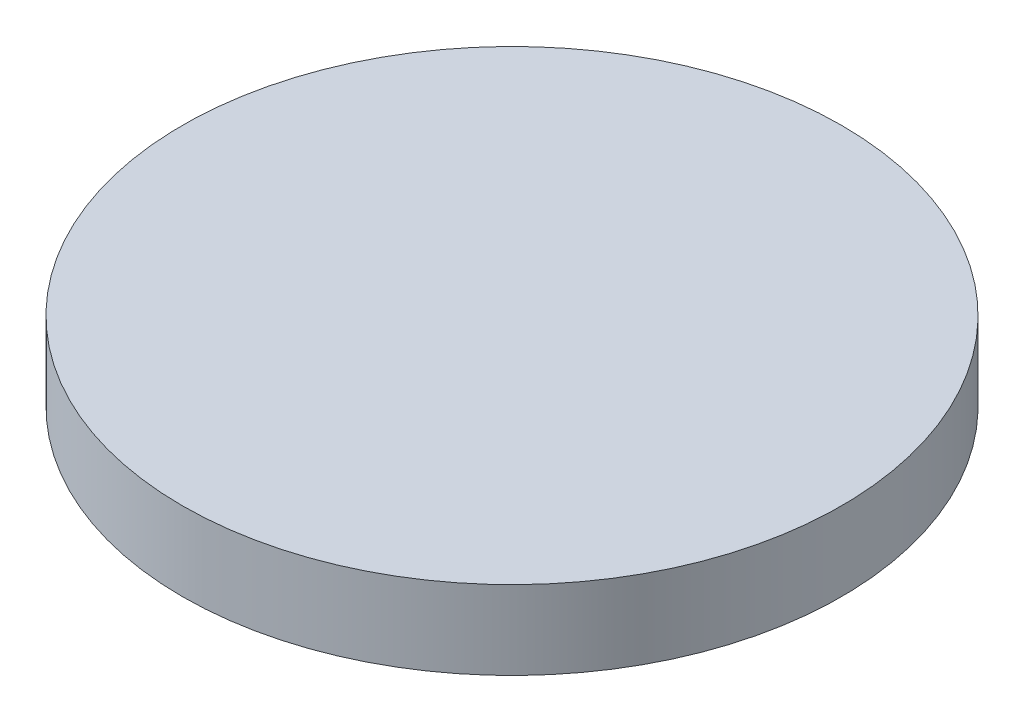
ISO-10303-21;
HEADER;
FILE_DESCRIPTION(('STEP AP214'),'2;1');
FILE_NAME('part.step','',(''),(''),'','','');
FILE_SCHEMA(('AUTOMOTIVE_DESIGN { 1 0 10303 214 1 1 1 1 }'));
ENDSEC;
DATA;
#1=APPLICATION_CONTEXT('core data for automotive mechanical design processes');
#2=APPLICATION_PROTOCOL_DEFINITION('international standard','automotive_design',2000,#1);
#3=PRODUCT_CONTEXT('',#1,'mechanical');
#4=PRODUCT('Part','Part','',(#3));
#5=PRODUCT_RELATED_PRODUCT_CATEGORY('part','',(#4));
#6=PRODUCT_DEFINITION_FORMATION('','',#4);
#7=PRODUCT_DEFINITION_CONTEXT('part definition',#1,'design');
#8=PRODUCT_DEFINITION('design','',#6,#7);
#9=PRODUCT_DEFINITION_SHAPE('','',#8);
#10=(LENGTH_UNIT() NAMED_UNIT(*) SI_UNIT(.MILLI.,.METRE.));
#11=(NAMED_UNIT(*) PLANE_ANGLE_UNIT() SI_UNIT($,.RADIAN.));
#12=(NAMED_UNIT(*) SI_UNIT($,.STERADIAN.) SOLID_ANGLE_UNIT());
#13=UNCERTAINTY_MEASURE_WITH_UNIT(LENGTH_MEASURE(1.E-05),#10,'distance_accuracy_value','');
#14=(GEOMETRIC_REPRESENTATION_CONTEXT(3) GLOBAL_UNCERTAINTY_ASSIGNED_CONTEXT((#13)) GLOBAL_UNIT_ASSIGNED_CONTEXT((#10,
#11,#12)) REPRESENTATION_CONTEXT('',''));
#15=CARTESIAN_POINT('',(0.,0.,0.));
#16=DIRECTION('',(0.,0.,1.));
#17=DIRECTION('',(1.,0.,0.));
#18=AXIS2_PLACEMENT_3D('',#15,#16,#17);
#19=CARTESIAN_POINT('',(0.,10.16,0.));
#20=DIRECTION('',(0.,-1.,0.));
#21=DIRECTION('',(0.,0.,-1.));
#22=AXIS2_PLACEMENT_3D('',#19,#20,#21);
#23=CYLINDRICAL_SURFACE('',#22,42.545);
#24=CARTESIAN_POINT('',(0.,10.16,0.));
#25=DIRECTION('',(0.,1.,0.));
#26=DIRECTION('',(0.,0.,1.));
#27=AXIS2_PLACEMENT_3D('',#24,#25,#26);
#28=CIRCLE('',#27,42.545);
#29=CARTESIAN_POINT('',(0.,10.16,42.545));
#30=VERTEX_POINT('',#29);
#31=EDGE_CURVE('E10',#30,#30,#28,.T.);
#32=ORIENTED_EDGE('',*,*,#31,.F.);
#33=EDGE_LOOP('',(#32));
#34=FACE_BOUND('',#33,.T.);
#35=CARTESIAN_POINT('',(0.,0.,0.));
#36=DIRECTION('',(0.,1.,0.));
#37=DIRECTION('',(0.,0.,1.));
#38=AXIS2_PLACEMENT_3D('',#35,#36,#37);
#39=CIRCLE('',#38,42.545);
#40=CARTESIAN_POINT('',(0.,0.,42.545));
#41=VERTEX_POINT('',#40);
#42=EDGE_CURVE('E40',#41,#41,#39,.T.);
#43=ORIENTED_EDGE('',*,*,#42,.T.);
#44=EDGE_LOOP('',(#43));
#45=FACE_BOUND('',#44,.T.);
#46=ADVANCED_FACE('F37',(#34,#45),#23,.T.);
#47=CARTESIAN_POINT('',(0.,10.16,0.));
#48=DIRECTION('',(0.,1.,0.));
#49=DIRECTION('',(0.,0.,1.));
#50=AXIS2_PLACEMENT_3D('',#47,#48,#49);
#51=PLANE('',#50);
#52=ORIENTED_EDGE('',*,*,#31,.T.);
#53=EDGE_LOOP('',(#52));
#54=FACE_BOUND('',#53,.T.);
#55=ADVANCED_FACE('F72',(#54),#51,.T.);
#56=CARTESIAN_POINT('',(0.,0.,0.));
#57=DIRECTION('',(0.,1.,0.));
#58=DIRECTION('',(0.,0.,1.));
#59=AXIS2_PLACEMENT_3D('',#56,#57,#58);
#60=PLANE('',#59);
#61=CARTESIAN_POINT('',(0.,0.,0.));
#62=DIRECTION('',(0.,1.,0.));
#63=DIRECTION('',(0.,0.,1.));
#64=AXIS2_PLACEMENT_3D('',#61,#62,#63);
#65=CIRCLE('',#64,41.275);
#66=CARTESIAN_POINT('',(0.,0.,41.275));
#67=VERTEX_POINT('',#66);
#68=EDGE_CURVE('E51',#67,#67,#65,.T.);
#69=ORIENTED_EDGE('',*,*,#68,.T.);
#70=EDGE_LOOP('',(#69));
#71=FACE_BOUND('',#70,.T.);
#72=ORIENTED_EDGE('',*,*,#42,.F.);
#73=EDGE_LOOP('',(#72));
#74=FACE_BOUND('',#73,.T.);
#75=ADVANCED_FACE('F68',(#71,#74),#60,.F.);
#76=CARTESIAN_POINT('',(0.,10.16,0.));
#77=DIRECTION('',(0.,-1.,0.));
#78=DIRECTION('',(0.,0.,-1.));
#79=AXIS2_PLACEMENT_3D('',#76,#77,#78);
#80=CYLINDRICAL_SURFACE('',#79,41.275);
#81=CARTESIAN_POINT('',(0.,8.89,0.));
#82=DIRECTION('',(0.,1.,0.));
#83=DIRECTION('',(0.,0.,1.));
#84=AXIS2_PLACEMENT_3D('',#81,#82,#83);
#85=CIRCLE('',#84,41.275);
#86=CARTESIAN_POINT('',(0.,8.89,41.275));
#87=VERTEX_POINT('',#86);
#88=EDGE_CURVE('E49',#87,#87,#85,.T.);
#89=ORIENTED_EDGE('',*,*,#88,.T.);
#90=EDGE_LOOP('',(#89));
#91=FACE_BOUND('',#90,.T.);
#92=ORIENTED_EDGE('',*,*,#68,.F.);
#93=EDGE_LOOP('',(#92));
#94=FACE_BOUND('',#93,.T.);
#95=ADVANCED_FACE('F59',(#91,#94),#80,.F.);
#96=CARTESIAN_POINT('',(0.,8.89,0.));
#97=DIRECTION('',(0.,1.,0.));
#98=DIRECTION('',(0.,0.,1.));
#99=AXIS2_PLACEMENT_3D('',#96,#97,#98);
#100=PLANE('',#99);
#101=ORIENTED_EDGE('',*,*,#88,.F.);
#102=EDGE_LOOP('',(#101));
#103=FACE_BOUND('',#102,.T.);
#104=ADVANCED_FACE('F62',(#103),#100,.F.);
#105=CLOSED_SHELL('',(#46,#55,#75,#95,#104));
#106=MANIFOLD_SOLID_BREP('B2',#105);
#107=ADVANCED_BREP_SHAPE_REPRESENTATION('',(#18,#106),#14);
#108=SHAPE_DEFINITION_REPRESENTATION(#9,#107);
ENDSEC;
END-ISO-10303-21;
